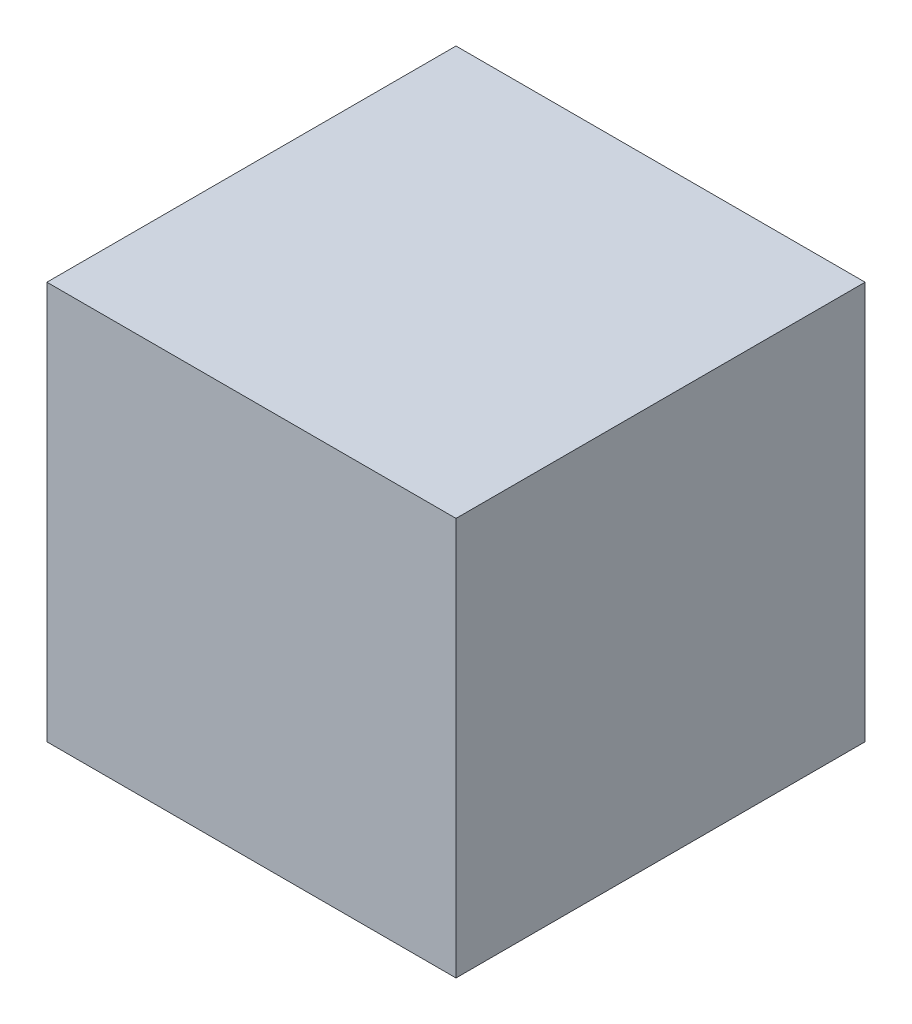
ISO-10303-21;
HEADER;
FILE_DESCRIPTION(('STEP AP214'),'2;1');
FILE_NAME('part.step','',(''),(''),'','','');
FILE_SCHEMA(('AUTOMOTIVE_DESIGN { 1 0 10303 214 1 1 1 1 }'));
ENDSEC;
DATA;
#1=APPLICATION_CONTEXT('core data for automotive mechanical design processes');
#2=APPLICATION_PROTOCOL_DEFINITION('international standard','automotive_design',2000,#1);
#3=PRODUCT_CONTEXT('',#1,'mechanical');
#4=PRODUCT('Part','Part','',(#3));
#5=PRODUCT_RELATED_PRODUCT_CATEGORY('part','',(#4));
#6=PRODUCT_DEFINITION_FORMATION('','',#4);
#7=PRODUCT_DEFINITION_CONTEXT('part definition',#1,'design');
#8=PRODUCT_DEFINITION('design','',#6,#7);
#9=PRODUCT_DEFINITION_SHAPE('','',#8);
#10=(LENGTH_UNIT() NAMED_UNIT(*) SI_UNIT(.MILLI.,.METRE.));
#11=(NAMED_UNIT(*) PLANE_ANGLE_UNIT() SI_UNIT($,.RADIAN.));
#12=(NAMED_UNIT(*) SI_UNIT($,.STERADIAN.) SOLID_ANGLE_UNIT());
#13=UNCERTAINTY_MEASURE_WITH_UNIT(LENGTH_MEASURE(1.E-05),#10,'distance_accuracy_value','');
#14=(GEOMETRIC_REPRESENTATION_CONTEXT(3) GLOBAL_UNCERTAINTY_ASSIGNED_CONTEXT((#13)) GLOBAL_UNIT_ASSIGNED_CONTEXT((#10,
#11,#12)) REPRESENTATION_CONTEXT('',''));
#15=CARTESIAN_POINT('',(0.,0.,0.));
#16=DIRECTION('',(0.,0.,1.));
#17=DIRECTION('',(1.,0.,0.));
#18=AXIS2_PLACEMENT_3D('',#15,#16,#17);
#19=CARTESIAN_POINT('',(469.9,914.4,469.9));
#20=DIRECTION('',(-1.,0.,0.));
#21=DIRECTION('',(0.,0.,1.));
#22=AXIS2_PLACEMENT_3D('',#19,#20,#21);
#23=PLANE('',#22);
#24=DIRECTION('',(0.,0.,-1.));
#25=VECTOR('',#24,1.);
#26=CARTESIAN_POINT('',(469.9,0.,469.9));
#27=LINE('',#26,#25);
#28=CARTESIAN_POINT('',(469.9,0.,469.9));
#29=VERTEX_POINT('',#28);
#30=CARTESIAN_POINT('',(469.9,0.,-469.9));
#31=VERTEX_POINT('',#30);
#32=EDGE_CURVE('E107',#29,#31,#27,.T.);
#33=ORIENTED_EDGE('',*,*,#32,.T.);
#34=DIRECTION('',(0.,-1.,0.));
#35=VECTOR('',#34,1.);
#36=CARTESIAN_POINT('',(469.9,914.4,-469.9));
#37=LINE('',#36,#35);
#38=CARTESIAN_POINT('',(469.9,914.4,-469.9));
#39=VERTEX_POINT('',#38);
#40=EDGE_CURVE('E11',#39,#31,#37,.T.);
#41=ORIENTED_EDGE('',*,*,#40,.F.);
#42=DIRECTION('',(0.,0.,-1.));
#43=VECTOR('',#42,1.);
#44=CARTESIAN_POINT('',(469.9,914.4,469.9));
#45=LINE('',#44,#43);
#46=CARTESIAN_POINT('',(469.9,914.4,469.9));
#47=VERTEX_POINT('',#46);
#48=EDGE_CURVE('E91',#47,#39,#45,.T.);
#49=ORIENTED_EDGE('',*,*,#48,.F.);
#50=DIRECTION('',(0.,-1.,0.));
#51=VECTOR('',#50,1.);
#52=CARTESIAN_POINT('',(469.9,914.4,469.9));
#53=LINE('',#52,#51);
#54=EDGE_CURVE('E103',#47,#29,#53,.T.);
#55=ORIENTED_EDGE('',*,*,#54,.T.);
#56=EDGE_LOOP('',(#33,#41,#49,#55));
#57=FACE_BOUND('',#56,.T.);
#58=ADVANCED_FACE('F39',(#57),#23,.F.);
#59=CARTESIAN_POINT('',(-469.9,914.4,-469.9));
#60=DIRECTION('',(0.,0.,1.));
#61=DIRECTION('',(1.,0.,0.));
#62=AXIS2_PLACEMENT_3D('',#59,#60,#61);
#63=PLANE('',#62);
#64=DIRECTION('',(-1.,0.,0.));
#65=VECTOR('',#64,1.);
#66=CARTESIAN_POINT('',(-469.9,0.,-469.9));
#67=LINE('',#66,#65);
#68=CARTESIAN_POINT('',(-469.9,0.,-469.9));
#69=VERTEX_POINT('',#68);
#70=EDGE_CURVE('E96',#31,#69,#67,.T.);
#71=ORIENTED_EDGE('',*,*,#70,.T.);
#72=DIRECTION('',(0.,-1.,0.));
#73=VECTOR('',#72,1.);
#74=CARTESIAN_POINT('',(-469.9,914.4,-469.9));
#75=LINE('',#74,#73);
#76=CARTESIAN_POINT('',(-469.9,914.4,-469.9));
#77=VERTEX_POINT('',#76);
#78=EDGE_CURVE('E48',#77,#69,#75,.T.);
#79=ORIENTED_EDGE('',*,*,#78,.F.);
#80=DIRECTION('',(-1.,0.,0.));
#81=VECTOR('',#80,1.);
#82=CARTESIAN_POINT('',(-469.9,914.4,-469.9));
#83=LINE('',#82,#81);
#84=EDGE_CURVE('E86',#39,#77,#83,.T.);
#85=ORIENTED_EDGE('',*,*,#84,.F.);
#86=ORIENTED_EDGE('',*,*,#40,.T.);
#87=EDGE_LOOP('',(#71,#79,#85,#86));
#88=FACE_BOUND('',#87,.T.);
#89=ADVANCED_FACE('F95',(#88),#63,.F.);
#90=CARTESIAN_POINT('',(-469.9,914.4,469.9));
#91=DIRECTION('',(1.,0.,0.));
#92=DIRECTION('',(0.,0.,-1.));
#93=AXIS2_PLACEMENT_3D('',#90,#91,#92);
#94=PLANE('',#93);
#95=DIRECTION('',(0.,0.,1.));
#96=VECTOR('',#95,1.);
#97=CARTESIAN_POINT('',(-469.9,0.,469.9));
#98=LINE('',#97,#96);
#99=CARTESIAN_POINT('',(-469.9,0.,469.9));
#100=VERTEX_POINT('',#99);
#101=EDGE_CURVE('E73',#69,#100,#98,.T.);
#102=ORIENTED_EDGE('',*,*,#101,.T.);
#103=DIRECTION('',(0.,-1.,0.));
#104=VECTOR('',#103,1.);
#105=CARTESIAN_POINT('',(-469.9,914.4,469.9));
#106=LINE('',#105,#104);
#107=CARTESIAN_POINT('',(-469.9,914.4,469.9));
#108=VERTEX_POINT('',#107);
#109=EDGE_CURVE('E98',#108,#100,#106,.T.);
#110=ORIENTED_EDGE('',*,*,#109,.F.);
#111=DIRECTION('',(0.,0.,1.));
#112=VECTOR('',#111,1.);
#113=CARTESIAN_POINT('',(-469.9,914.4,469.9));
#114=LINE('',#113,#112);
#115=EDGE_CURVE('E89',#77,#108,#114,.T.);
#116=ORIENTED_EDGE('',*,*,#115,.F.);
#117=ORIENTED_EDGE('',*,*,#78,.T.);
#118=EDGE_LOOP('',(#102,#110,#116,#117));
#119=FACE_BOUND('',#118,.T.);
#120=ADVANCED_FACE('F99',(#119),#94,.F.);
#121=CARTESIAN_POINT('',(-469.9,914.4,469.9));
#122=DIRECTION('',(0.,0.,-1.));
#123=DIRECTION('',(-1.,0.,0.));
#124=AXIS2_PLACEMENT_3D('',#121,#122,#123);
#125=PLANE('',#124);
#126=DIRECTION('',(1.,0.,0.));
#127=VECTOR('',#126,1.);
#128=CARTESIAN_POINT('',(-469.9,0.,469.9));
#129=LINE('',#128,#127);
#130=EDGE_CURVE('E79',#100,#29,#129,.T.);
#131=ORIENTED_EDGE('',*,*,#130,.T.);
#132=ORIENTED_EDGE('',*,*,#54,.F.);
#133=DIRECTION('',(1.,0.,0.));
#134=VECTOR('',#133,1.);
#135=CARTESIAN_POINT('',(-469.9,914.4,469.9));
#136=LINE('',#135,#134);
#137=EDGE_CURVE('E56',#108,#47,#136,.T.);
#138=ORIENTED_EDGE('',*,*,#137,.F.);
#139=ORIENTED_EDGE('',*,*,#109,.T.);
#140=EDGE_LOOP('',(#131,#132,#138,#139));
#141=FACE_BOUND('',#140,.T.);
#142=ADVANCED_FACE('F120',(#141),#125,.F.);
#143=CARTESIAN_POINT('',(0.,914.4,0.));
#144=DIRECTION('',(0.,-1.,0.));
#145=DIRECTION('',(0.,0.,-1.));
#146=AXIS2_PLACEMENT_3D('',#143,#144,#145);
#147=PLANE('',#146);
#148=ORIENTED_EDGE('',*,*,#48,.T.);
#149=ORIENTED_EDGE('',*,*,#84,.T.);
#150=ORIENTED_EDGE('',*,*,#115,.T.);
#151=ORIENTED_EDGE('',*,*,#137,.T.);
#152=EDGE_LOOP('',(#148,#149,#150,#151));
#153=FACE_BOUND('',#152,.T.);
#154=ADVANCED_FACE('F87',(#153),#147,.F.);
#155=CARTESIAN_POINT('',(0.,0.,0.));
#156=DIRECTION('',(0.,-1.,0.));
#157=DIRECTION('',(0.,0.,-1.));
#158=AXIS2_PLACEMENT_3D('',#155,#156,#157);
#159=PLANE('',#158);
#160=ORIENTED_EDGE('',*,*,#32,.F.);
#161=ORIENTED_EDGE('',*,*,#130,.F.);
#162=ORIENTED_EDGE('',*,*,#101,.F.);
#163=ORIENTED_EDGE('',*,*,#70,.F.);
#164=EDGE_LOOP('',(#160,#161,#162,#163));
#165=FACE_BOUND('',#164,.T.);
#166=ADVANCED_FACE('F123',(#165),#159,.T.);
#167=CLOSED_SHELL('',(#58,#89,#120,#142,#154,#166));
#168=MANIFOLD_SOLID_BREP('B2',#167);
#169=ADVANCED_BREP_SHAPE_REPRESENTATION('',(#18,#168),#14);
#170=SHAPE_DEFINITION_REPRESENTATION(#9,#169);
ENDSEC;
END-ISO-10303-21;
